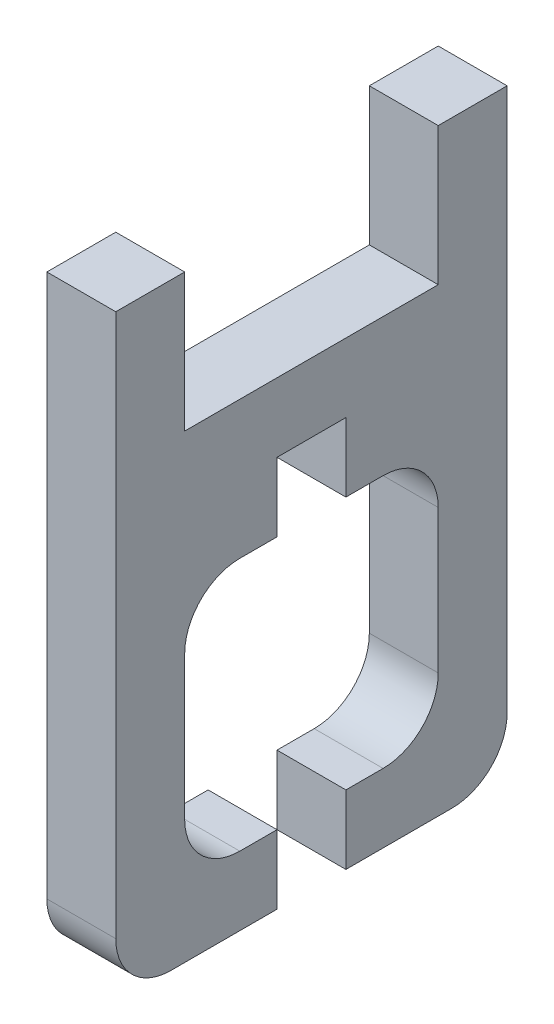
ISO-10303-21;
HEADER;
FILE_DESCRIPTION(('STEP AP214'),'2;1');
FILE_NAME('part.step','',(''),(''),'','','');
FILE_SCHEMA(('AUTOMOTIVE_DESIGN { 1 0 10303 214 1 1 1 1 }'));
ENDSEC;
DATA;
#1=APPLICATION_CONTEXT('core data for automotive mechanical design processes');
#2=APPLICATION_PROTOCOL_DEFINITION('international standard','automotive_design',2000,#1);
#3=PRODUCT_CONTEXT('',#1,'mechanical');
#4=PRODUCT('Part','Part','',(#3));
#5=PRODUCT_RELATED_PRODUCT_CATEGORY('part','',(#4));
#6=PRODUCT_DEFINITION_FORMATION('','',#4);
#7=PRODUCT_DEFINITION_CONTEXT('part definition',#1,'design');
#8=PRODUCT_DEFINITION('design','',#6,#7);
#9=PRODUCT_DEFINITION_SHAPE('','',#8);
#10=(LENGTH_UNIT() NAMED_UNIT(*) SI_UNIT(.MILLI.,.METRE.));
#11=(NAMED_UNIT(*) PLANE_ANGLE_UNIT() SI_UNIT($,.RADIAN.));
#12=(NAMED_UNIT(*) SI_UNIT($,.STERADIAN.) SOLID_ANGLE_UNIT());
#13=UNCERTAINTY_MEASURE_WITH_UNIT(LENGTH_MEASURE(1.E-05),#10,'distance_accuracy_value','');
#14=(GEOMETRIC_REPRESENTATION_CONTEXT(3) GLOBAL_UNCERTAINTY_ASSIGNED_CONTEXT((#13)) GLOBAL_UNIT_ASSIGNED_CONTEXT((#10,
#11,#12)) REPRESENTATION_CONTEXT('',''));
#15=CARTESIAN_POINT('',(0.,0.,0.));
#16=DIRECTION('',(0.,0.,1.));
#17=DIRECTION('',(1.,0.,0.));
#18=AXIS2_PLACEMENT_3D('',#15,#16,#17);
#19=CARTESIAN_POINT('',(6.35,0.,0.));
#20=DIRECTION('',(0.,0.,-1.));
#21=DIRECTION('',(0.,1.,0.));
#22=AXIS2_PLACEMENT_3D('',#19,#20,#21);
#23=PLANE('',#22);
#24=DIRECTION('',(0.,-1.,0.));
#25=VECTOR('',#24,1.);
#26=CARTESIAN_POINT('',(0.,0.,0.));
#27=LINE('',#26,#25);
#28=CARTESIAN_POINT('',(0.,55.118,0.));
#29=VERTEX_POINT('',#28);
#30=CARTESIAN_POINT('',(0.,5.08000000000004,0.));
#31=VERTEX_POINT('',#30);
#32=EDGE_CURVE('E251',#29,#31,#27,.T.);
#33=ORIENTED_EDGE('',*,*,#32,.T.);
#34=DIRECTION('',(-1.,0.,0.));
#35=VECTOR('',#34,1.);
#36=CARTESIAN_POINT('',(6.35,5.08000000000004,0.));
#37=LINE('',#36,#35);
#38=CARTESIAN_POINT('',(6.35,5.08000000000004,0.));
#39=VERTEX_POINT('',#38);
#40=EDGE_CURVE('E11',#39,#31,#37,.T.);
#41=ORIENTED_EDGE('',*,*,#40,.F.);
#42=DIRECTION('',(0.,-1.,0.));
#43=VECTOR('',#42,1.);
#44=CARTESIAN_POINT('',(6.35,0.,0.));
#45=LINE('',#44,#43);
#46=CARTESIAN_POINT('',(6.35,55.118,0.));
#47=VERTEX_POINT('',#46);
#48=EDGE_CURVE('E341',#47,#39,#45,.T.);
#49=ORIENTED_EDGE('',*,*,#48,.F.);
#50=DIRECTION('',(-1.,0.,0.));
#51=VECTOR('',#50,1.);
#52=CARTESIAN_POINT('',(6.35,55.118,0.));
#53=LINE('',#52,#51);
#54=EDGE_CURVE('E58',#47,#29,#53,.T.);
#55=ORIENTED_EDGE('',*,*,#54,.T.);
#56=EDGE_LOOP('',(#33,#41,#49,#55));
#57=FACE_BOUND('',#56,.T.);
#58=ADVANCED_FACE('F41',(#57),#23,.F.);
#59=CARTESIAN_POINT('',(6.35,5.08,-5.08));
#60=DIRECTION('',(-1.,0.,0.));
#61=DIRECTION('',(0.,0.,1.));
#62=AXIS2_PLACEMENT_3D('',#59,#60,#61);
#63=CYLINDRICAL_SURFACE('',#62,5.08);
#64=CARTESIAN_POINT('',(0.,5.08,-5.08));
#65=DIRECTION('',(1.,0.,0.));
#66=DIRECTION('',(0.,0.,-1.));
#67=AXIS2_PLACEMENT_3D('',#64,#65,#66);
#68=CIRCLE('',#67,5.08);
#69=CARTESIAN_POINT('',(0.,0.,-5.08000000000004));
#70=VERTEX_POINT('',#69);
#71=EDGE_CURVE('E254',#31,#70,#68,.T.);
#72=ORIENTED_EDGE('',*,*,#71,.T.);
#73=DIRECTION('',(-1.,0.,0.));
#74=VECTOR('',#73,1.);
#75=CARTESIAN_POINT('',(6.35,0.,-5.08000000000004));
#76=LINE('',#75,#74);
#77=CARTESIAN_POINT('',(6.35,0.,-5.08000000000004));
#78=VERTEX_POINT('',#77);
#79=EDGE_CURVE('E50',#78,#70,#76,.T.);
#80=ORIENTED_EDGE('',*,*,#79,.F.);
#81=CARTESIAN_POINT('',(6.35,5.08,-5.08));
#82=DIRECTION('',(1.,0.,0.));
#83=DIRECTION('',(0.,0.,-1.));
#84=AXIS2_PLACEMENT_3D('',#81,#82,#83);
#85=CIRCLE('',#84,5.08);
#86=EDGE_CURVE('E150',#39,#78,#85,.T.);
#87=ORIENTED_EDGE('',*,*,#86,.F.);
#88=ORIENTED_EDGE('',*,*,#40,.T.);
#89=EDGE_LOOP('',(#72,#80,#87,#88));
#90=FACE_BOUND('',#89,.T.);
#91=ADVANCED_FACE('F417',(#90),#63,.T.);
#92=CARTESIAN_POINT('',(6.35,0.,0.));
#93=DIRECTION('',(0.,-1.,0.));
#94=DIRECTION('',(0.,0.,-1.));
#95=AXIS2_PLACEMENT_3D('',#92,#93,#94);
#96=PLANE('',#95);
#97=DIRECTION('',(0.,0.,1.));
#98=VECTOR('',#97,1.);
#99=CARTESIAN_POINT('',(0.,0.,0.));
#100=LINE('',#99,#98);
#101=CARTESIAN_POINT('',(0.,0.,-14.859));
#102=VERTEX_POINT('',#101);
#103=EDGE_CURVE('E258',#102,#70,#100,.T.);
#104=ORIENTED_EDGE('',*,*,#103,.F.);
#105=DIRECTION('',(-1.,0.,0.));
#106=VECTOR('',#105,1.);
#107=CARTESIAN_POINT('',(6.35,0.,-14.859));
#108=LINE('',#107,#106);
#109=CARTESIAN_POINT('',(6.35,0.,-14.859));
#110=VERTEX_POINT('',#109);
#111=EDGE_CURVE('E408',#110,#102,#108,.T.);
#112=ORIENTED_EDGE('',*,*,#111,.F.);
#113=DIRECTION('',(0.,0.,1.));
#114=VECTOR('',#113,1.);
#115=CARTESIAN_POINT('',(6.35,0.,0.));
#116=LINE('',#115,#114);
#117=EDGE_CURVE('E416',#110,#78,#116,.T.);
#118=ORIENTED_EDGE('',*,*,#117,.T.);
#119=ORIENTED_EDGE('',*,*,#79,.T.);
#120=EDGE_LOOP('',(#104,#112,#118,#119));
#121=FACE_BOUND('',#120,.T.);
#122=ADVANCED_FACE('F414',(#121),#96,.T.);
#123=CARTESIAN_POINT('',(6.35,0.,-14.859));
#124=DIRECTION('',(0.,0.,-1.));
#125=DIRECTION('',(0.,1.,0.));
#126=AXIS2_PLACEMENT_3D('',#123,#124,#125);
#127=PLANE('',#126);
#128=DIRECTION('',(0.,-1.,0.));
#129=VECTOR('',#128,1.);
#130=CARTESIAN_POINT('',(0.,0.,-14.859));
#131=LINE('',#130,#129);
#132=CARTESIAN_POINT('',(0.,6.35,-14.859));
#133=VERTEX_POINT('',#132);
#134=EDGE_CURVE('E262',#133,#102,#131,.T.);
#135=ORIENTED_EDGE('',*,*,#134,.F.);
#136=DIRECTION('',(-1.,0.,0.));
#137=VECTOR('',#136,1.);
#138=CARTESIAN_POINT('',(6.35,6.35,-14.859));
#139=LINE('',#138,#137);
#140=CARTESIAN_POINT('',(6.35,6.35,-14.859));
#141=VERTEX_POINT('',#140);
#142=EDGE_CURVE('E405',#141,#133,#139,.T.);
#143=ORIENTED_EDGE('',*,*,#142,.F.);
#144=DIRECTION('',(0.,-1.,0.));
#145=VECTOR('',#144,1.);
#146=CARTESIAN_POINT('',(6.35,0.,-14.859));
#147=LINE('',#146,#145);
#148=EDGE_CURVE('E428',#141,#110,#147,.T.);
#149=ORIENTED_EDGE('',*,*,#148,.T.);
#150=ORIENTED_EDGE('',*,*,#111,.T.);
#151=EDGE_LOOP('',(#135,#143,#149,#150));
#152=FACE_BOUND('',#151,.T.);
#153=ADVANCED_FACE('F425',(#152),#127,.T.);
#154=CARTESIAN_POINT('',(6.35,6.35,0.));
#155=DIRECTION('',(0.,1.,0.));
#156=DIRECTION('',(0.,0.,1.));
#157=AXIS2_PLACEMENT_3D('',#154,#155,#156);
#158=PLANE('',#157);
#159=DIRECTION('',(0.,0.,-1.));
#160=VECTOR('',#159,1.);
#161=CARTESIAN_POINT('',(0.,6.35,0.));
#162=LINE('',#161,#160);
#163=CARTESIAN_POINT('',(0.,6.35,-11.43));
#164=VERTEX_POINT('',#163);
#165=EDGE_CURVE('E267',#164,#133,#162,.T.);
#166=ORIENTED_EDGE('',*,*,#165,.F.);
#167=DIRECTION('',(-1.,0.,0.));
#168=VECTOR('',#167,1.);
#169=CARTESIAN_POINT('',(6.35,6.35,-11.43));
#170=LINE('',#169,#168);
#171=CARTESIAN_POINT('',(6.35,6.35,-11.43));
#172=VERTEX_POINT('',#171);
#173=EDGE_CURVE('E402',#172,#164,#170,.T.);
#174=ORIENTED_EDGE('',*,*,#173,.F.);
#175=DIRECTION('',(0.,0.,-1.));
#176=VECTOR('',#175,1.);
#177=CARTESIAN_POINT('',(6.35,6.35,0.));
#178=LINE('',#177,#176);
#179=EDGE_CURVE('E436',#172,#141,#178,.T.);
#180=ORIENTED_EDGE('',*,*,#179,.T.);
#181=ORIENTED_EDGE('',*,*,#142,.T.);
#182=EDGE_LOOP('',(#166,#174,#180,#181));
#183=FACE_BOUND('',#182,.T.);
#184=ADVANCED_FACE('F562',(#183),#158,.T.);
#185=CARTESIAN_POINT('',(6.35,11.43,-11.43));
#186=DIRECTION('',(-1.,0.,0.));
#187=DIRECTION('',(0.,0.,1.));
#188=AXIS2_PLACEMENT_3D('',#185,#186,#187);
#189=CYLINDRICAL_SURFACE('',#188,5.08);
#190=CARTESIAN_POINT('',(0.,11.43,-11.43));
#191=DIRECTION('',(1.,0.,0.));
#192=DIRECTION('',(0.,0.,-1.));
#193=AXIS2_PLACEMENT_3D('',#190,#191,#192);
#194=CIRCLE('',#193,5.08);
#195=CARTESIAN_POINT('',(0.,11.43,-6.35));
#196=VERTEX_POINT('',#195);
#197=EDGE_CURVE('E271',#164,#196,#194,.F.);
#198=ORIENTED_EDGE('',*,*,#197,.T.);
#199=DIRECTION('',(-1.,0.,0.));
#200=VECTOR('',#199,1.);
#201=CARTESIAN_POINT('',(6.35,11.43,-6.35));
#202=LINE('',#201,#200);
#203=CARTESIAN_POINT('',(6.35,11.43,-6.35));
#204=VERTEX_POINT('',#203);
#205=EDGE_CURVE('E398',#204,#196,#202,.T.);
#206=ORIENTED_EDGE('',*,*,#205,.F.);
#207=CARTESIAN_POINT('',(6.35,11.43,-11.43));
#208=DIRECTION('',(1.,0.,0.));
#209=DIRECTION('',(0.,0.,-1.));
#210=AXIS2_PLACEMENT_3D('',#207,#208,#209);
#211=CIRCLE('',#210,5.08);
#212=EDGE_CURVE('E560',#172,#204,#211,.F.);
#213=ORIENTED_EDGE('',*,*,#212,.F.);
#214=ORIENTED_EDGE('',*,*,#173,.T.);
#215=EDGE_LOOP('',(#198,#206,#213,#214));
#216=FACE_BOUND('',#215,.T.);
#217=ADVANCED_FACE('F559',(#216),#189,.F.);
#218=CARTESIAN_POINT('',(6.35,0.,-6.35));
#219=DIRECTION('',(0.,0.,1.));
#220=DIRECTION('',(1.,0.,0.));
#221=AXIS2_PLACEMENT_3D('',#218,#219,#220);
#222=PLANE('',#221);
#223=DIRECTION('',(0.,1.,0.));
#224=VECTOR('',#223,1.);
#225=CARTESIAN_POINT('',(0.,0.,-6.35));
#226=LINE('',#225,#224);
#227=CARTESIAN_POINT('',(0.,24.638,-6.35));
#228=VERTEX_POINT('',#227);
#229=EDGE_CURVE('E275',#196,#228,#226,.T.);
#230=ORIENTED_EDGE('',*,*,#229,.T.);
#231=DIRECTION('',(-1.,0.,0.));
#232=VECTOR('',#231,1.);
#233=CARTESIAN_POINT('',(6.35,24.638,-6.35));
#234=LINE('',#233,#232);
#235=CARTESIAN_POINT('',(6.35,24.638,-6.35));
#236=VERTEX_POINT('',#235);
#237=EDGE_CURVE('E394',#236,#228,#234,.T.);
#238=ORIENTED_EDGE('',*,*,#237,.F.);
#239=DIRECTION('',(0.,1.,0.));
#240=VECTOR('',#239,1.);
#241=CARTESIAN_POINT('',(6.35,0.,-6.35));
#242=LINE('',#241,#240);
#243=EDGE_CURVE('E555',#204,#236,#242,.T.);
#244=ORIENTED_EDGE('',*,*,#243,.F.);
#245=ORIENTED_EDGE('',*,*,#205,.T.);
#246=EDGE_LOOP('',(#230,#238,#244,#245));
#247=FACE_BOUND('',#246,.T.);
#248=ADVANCED_FACE('F554',(#247),#222,.F.);
#249=CARTESIAN_POINT('',(6.35,24.638,-11.43));
#250=DIRECTION('',(-1.,0.,0.));
#251=DIRECTION('',(0.,0.,1.));
#252=AXIS2_PLACEMENT_3D('',#249,#250,#251);
#253=CYLINDRICAL_SURFACE('',#252,5.08);
#254=CARTESIAN_POINT('',(0.,24.638,-11.43));
#255=DIRECTION('',(1.,0.,0.));
#256=DIRECTION('',(0.,0.,-1.));
#257=AXIS2_PLACEMENT_3D('',#254,#255,#256);
#258=CIRCLE('',#257,5.08);
#259=CARTESIAN_POINT('',(0.,29.718,-11.43));
#260=VERTEX_POINT('',#259);
#261=EDGE_CURVE('E278',#228,#260,#258,.F.);
#262=ORIENTED_EDGE('',*,*,#261,.T.);
#263=DIRECTION('',(-1.,0.,0.));
#264=VECTOR('',#263,1.);
#265=CARTESIAN_POINT('',(6.35,29.718,-11.43));
#266=LINE('',#265,#264);
#267=CARTESIAN_POINT('',(6.35,29.718,-11.43));
#268=VERTEX_POINT('',#267);
#269=EDGE_CURVE('E391',#268,#260,#266,.T.);
#270=ORIENTED_EDGE('',*,*,#269,.F.);
#271=CARTESIAN_POINT('',(6.35,24.638,-11.43));
#272=DIRECTION('',(1.,0.,0.));
#273=DIRECTION('',(0.,0.,-1.));
#274=AXIS2_PLACEMENT_3D('',#271,#272,#273);
#275=CIRCLE('',#274,5.08);
#276=EDGE_CURVE('E551',#236,#268,#275,.F.);
#277=ORIENTED_EDGE('',*,*,#276,.F.);
#278=ORIENTED_EDGE('',*,*,#237,.T.);
#279=EDGE_LOOP('',(#262,#270,#277,#278));
#280=FACE_BOUND('',#279,.T.);
#281=ADVANCED_FACE('F548',(#280),#253,.F.);
#282=CARTESIAN_POINT('',(6.35,29.718,0.));
#283=DIRECTION('',(0.,-1.,0.));
#284=DIRECTION('',(0.,0.,-1.));
#285=AXIS2_PLACEMENT_3D('',#282,#283,#284);
#286=PLANE('',#285);
#287=DIRECTION('',(0.,0.,1.));
#288=VECTOR('',#287,1.);
#289=CARTESIAN_POINT('',(0.,29.718,0.));
#290=LINE('',#289,#288);
#291=CARTESIAN_POINT('',(0.,29.718,-14.859));
#292=VERTEX_POINT('',#291);
#293=EDGE_CURVE('E282',#292,#260,#290,.T.);
#294=ORIENTED_EDGE('',*,*,#293,.F.);
#295=DIRECTION('',(-1.,0.,0.));
#296=VECTOR('',#295,1.);
#297=CARTESIAN_POINT('',(6.35,29.718,-14.859));
#298=LINE('',#297,#296);
#299=CARTESIAN_POINT('',(6.35,29.718,-14.859));
#300=VERTEX_POINT('',#299);
#301=EDGE_CURVE('E388',#300,#292,#298,.T.);
#302=ORIENTED_EDGE('',*,*,#301,.F.);
#303=DIRECTION('',(0.,0.,1.));
#304=VECTOR('',#303,1.);
#305=CARTESIAN_POINT('',(6.35,29.718,0.));
#306=LINE('',#305,#304);
#307=EDGE_CURVE('E571',#300,#268,#306,.T.);
#308=ORIENTED_EDGE('',*,*,#307,.T.);
#309=ORIENTED_EDGE('',*,*,#269,.T.);
#310=EDGE_LOOP('',(#294,#302,#308,#309));
#311=FACE_BOUND('',#310,.T.);
#312=ADVANCED_FACE('F543',(#311),#286,.T.);
#313=CARTESIAN_POINT('',(6.35,0.,-14.859));
#314=DIRECTION('',(0.,0.,-1.));
#315=DIRECTION('',(-1.,0.,0.));
#316=AXIS2_PLACEMENT_3D('',#313,#314,#315);
#317=PLANE('',#316);
#318=DIRECTION('',(0.,-1.,0.));
#319=VECTOR('',#318,1.);
#320=CARTESIAN_POINT('',(0.,0.,-14.859));
#321=LINE('',#320,#319);
#322=CARTESIAN_POINT('',(0.,36.068,-14.859));
#323=VERTEX_POINT('',#322);
#324=EDGE_CURVE('E286',#323,#292,#321,.T.);
#325=ORIENTED_EDGE('',*,*,#324,.F.);
#326=DIRECTION('',(-1.,0.,0.));
#327=VECTOR('',#326,1.);
#328=CARTESIAN_POINT('',(6.35,36.068,-14.859));
#329=LINE('',#328,#327);
#330=CARTESIAN_POINT('',(6.35,36.068,-14.859));
#331=VERTEX_POINT('',#330);
#332=EDGE_CURVE('E385',#331,#323,#329,.T.);
#333=ORIENTED_EDGE('',*,*,#332,.F.);
#334=DIRECTION('',(0.,-1.,0.));
#335=VECTOR('',#334,1.);
#336=CARTESIAN_POINT('',(6.35,0.,-14.859));
#337=LINE('',#336,#335);
#338=EDGE_CURVE('E539',#331,#300,#337,.T.);
#339=ORIENTED_EDGE('',*,*,#338,.T.);
#340=ORIENTED_EDGE('',*,*,#301,.T.);
#341=EDGE_LOOP('',(#325,#333,#339,#340));
#342=FACE_BOUND('',#341,.T.);
#343=ADVANCED_FACE('F537',(#342),#317,.T.);
#344=CARTESIAN_POINT('',(6.35,36.068,0.));
#345=DIRECTION('',(0.,-1.,0.));
#346=DIRECTION('',(0.,0.,-1.));
#347=AXIS2_PLACEMENT_3D('',#344,#345,#346);
#348=PLANE('',#347);
#349=DIRECTION('',(0.,0.,1.));
#350=VECTOR('',#349,1.);
#351=CARTESIAN_POINT('',(0.,36.068,0.));
#352=LINE('',#351,#350);
#353=CARTESIAN_POINT('',(0.,36.068,-21.209));
#354=VERTEX_POINT('',#353);
#355=EDGE_CURVE('E290',#354,#323,#352,.T.);
#356=ORIENTED_EDGE('',*,*,#355,.F.);
#357=DIRECTION('',(-1.,0.,0.));
#358=VECTOR('',#357,1.);
#359=CARTESIAN_POINT('',(6.35,36.068,-21.209));
#360=LINE('',#359,#358);
#361=CARTESIAN_POINT('',(6.35,36.068,-21.209));
#362=VERTEX_POINT('',#361);
#363=EDGE_CURVE('E382',#362,#354,#360,.T.);
#364=ORIENTED_EDGE('',*,*,#363,.F.);
#365=DIRECTION('',(0.,0.,1.));
#366=VECTOR('',#365,1.);
#367=CARTESIAN_POINT('',(6.35,36.068,0.));
#368=LINE('',#367,#366);
#369=EDGE_CURVE('E533',#362,#331,#368,.T.);
#370=ORIENTED_EDGE('',*,*,#369,.T.);
#371=ORIENTED_EDGE('',*,*,#332,.T.);
#372=EDGE_LOOP('',(#356,#364,#370,#371));
#373=FACE_BOUND('',#372,.T.);
#374=ADVANCED_FACE('F530',(#373),#348,.T.);
#375=CARTESIAN_POINT('',(6.35,0.,-21.209));
#376=DIRECTION('',(0.,0.,1.));
#377=DIRECTION('',(1.,0.,0.));
#378=AXIS2_PLACEMENT_3D('',#375,#376,#377);
#379=PLANE('',#378);
#380=DIRECTION('',(0.,1.,0.));
#381=VECTOR('',#380,1.);
#382=CARTESIAN_POINT('',(0.,0.,-21.209));
#383=LINE('',#382,#381);
#384=CARTESIAN_POINT('',(0.,29.718,-21.209));
#385=VERTEX_POINT('',#384);
#386=EDGE_CURVE('E294',#385,#354,#383,.T.);
#387=ORIENTED_EDGE('',*,*,#386,.F.);
#388=DIRECTION('',(-1.,0.,0.));
#389=VECTOR('',#388,1.);
#390=CARTESIAN_POINT('',(6.35,29.718,-21.209));
#391=LINE('',#390,#389);
#392=CARTESIAN_POINT('',(6.35,29.718,-21.209));
#393=VERTEX_POINT('',#392);
#394=EDGE_CURVE('E379',#393,#385,#391,.T.);
#395=ORIENTED_EDGE('',*,*,#394,.F.);
#396=DIRECTION('',(0.,1.,0.));
#397=VECTOR('',#396,1.);
#398=CARTESIAN_POINT('',(6.35,0.,-21.209));
#399=LINE('',#398,#397);
#400=EDGE_CURVE('E578',#393,#362,#399,.T.);
#401=ORIENTED_EDGE('',*,*,#400,.T.);
#402=ORIENTED_EDGE('',*,*,#363,.T.);
#403=EDGE_LOOP('',(#387,#395,#401,#402));
#404=FACE_BOUND('',#403,.T.);
#405=ADVANCED_FACE('F526',(#404),#379,.T.);
#406=CARTESIAN_POINT('',(6.35,29.718,0.));
#407=DIRECTION('',(0.,-1.,0.));
#408=DIRECTION('',(0.,0.,-1.));
#409=AXIS2_PLACEMENT_3D('',#406,#407,#408);
#410=PLANE('',#409);
#411=DIRECTION('',(0.,0.,1.));
#412=VECTOR('',#411,1.);
#413=CARTESIAN_POINT('',(0.,29.718,0.));
#414=LINE('',#413,#412);
#415=CARTESIAN_POINT('',(0.,29.718,-24.638));
#416=VERTEX_POINT('',#415);
#417=EDGE_CURVE('E298',#416,#385,#414,.T.);
#418=ORIENTED_EDGE('',*,*,#417,.F.);
#419=DIRECTION('',(-1.,0.,0.));
#420=VECTOR('',#419,1.);
#421=CARTESIAN_POINT('',(6.35,29.718,-24.638));
#422=LINE('',#421,#420);
#423=CARTESIAN_POINT('',(6.35,29.718,-24.638));
#424=VERTEX_POINT('',#423);
#425=EDGE_CURVE('E376',#424,#416,#422,.T.);
#426=ORIENTED_EDGE('',*,*,#425,.F.);
#427=DIRECTION('',(0.,0.,1.));
#428=VECTOR('',#427,1.);
#429=CARTESIAN_POINT('',(6.35,29.718,0.));
#430=LINE('',#429,#428);
#431=EDGE_CURVE('E522',#424,#393,#430,.T.);
#432=ORIENTED_EDGE('',*,*,#431,.T.);
#433=ORIENTED_EDGE('',*,*,#394,.T.);
#434=EDGE_LOOP('',(#418,#426,#432,#433));
#435=FACE_BOUND('',#434,.T.);
#436=ADVANCED_FACE('F517',(#435),#410,.T.);
#437=CARTESIAN_POINT('',(6.35,24.638,-24.638));
#438=DIRECTION('',(-1.,0.,0.));
#439=DIRECTION('',(0.,0.,1.));
#440=AXIS2_PLACEMENT_3D('',#437,#438,#439);
#441=CYLINDRICAL_SURFACE('',#440,5.08);
#442=CARTESIAN_POINT('',(0.,24.638,-24.638));
#443=DIRECTION('',(1.,0.,0.));
#444=DIRECTION('',(0.,0.,-1.));
#445=AXIS2_PLACEMENT_3D('',#442,#443,#444);
#446=CIRCLE('',#445,5.08);
#447=CARTESIAN_POINT('',(0.,24.638,-29.718));
#448=VERTEX_POINT('',#447);
#449=EDGE_CURVE('E302',#416,#448,#446,.F.);
#450=ORIENTED_EDGE('',*,*,#449,.T.);
#451=DIRECTION('',(-1.,0.,0.));
#452=VECTOR('',#451,1.);
#453=CARTESIAN_POINT('',(6.35,24.638,-29.718));
#454=LINE('',#453,#452);
#455=CARTESIAN_POINT('',(6.35,24.638,-29.718));
#456=VERTEX_POINT('',#455);
#457=EDGE_CURVE('E373',#456,#448,#454,.T.);
#458=ORIENTED_EDGE('',*,*,#457,.F.);
#459=CARTESIAN_POINT('',(6.35,24.638,-24.638));
#460=DIRECTION('',(1.,0.,0.));
#461=DIRECTION('',(0.,0.,-1.));
#462=AXIS2_PLACEMENT_3D('',#459,#460,#461);
#463=CIRCLE('',#462,5.08);
#464=EDGE_CURVE('E583',#424,#456,#463,.F.);
#465=ORIENTED_EDGE('',*,*,#464,.F.);
#466=ORIENTED_EDGE('',*,*,#425,.T.);
#467=EDGE_LOOP('',(#450,#458,#465,#466));
#468=FACE_BOUND('',#467,.T.);
#469=ADVANCED_FACE('F588',(#468),#441,.F.);
#470=CARTESIAN_POINT('',(6.35,0.,-29.718));
#471=DIRECTION('',(0.,0.,1.));
#472=DIRECTION('',(1.,0.,0.));
#473=AXIS2_PLACEMENT_3D('',#470,#471,#472);
#474=PLANE('',#473);
#475=DIRECTION('',(0.,1.,0.));
#476=VECTOR('',#475,1.);
#477=CARTESIAN_POINT('',(0.,0.,-29.718));
#478=LINE('',#477,#476);
#479=CARTESIAN_POINT('',(0.,11.43,-29.718));
#480=VERTEX_POINT('',#479);
#481=EDGE_CURVE('E306',#480,#448,#478,.T.);
#482=ORIENTED_EDGE('',*,*,#481,.F.);
#483=DIRECTION('',(-1.,0.,0.));
#484=VECTOR('',#483,1.);
#485=CARTESIAN_POINT('',(6.35,11.43,-29.718));
#486=LINE('',#485,#484);
#487=CARTESIAN_POINT('',(6.35,11.43,-29.718));
#488=VERTEX_POINT('',#487);
#489=EDGE_CURVE('E370',#488,#480,#486,.T.);
#490=ORIENTED_EDGE('',*,*,#489,.F.);
#491=DIRECTION('',(0.,1.,0.));
#492=VECTOR('',#491,1.);
#493=CARTESIAN_POINT('',(6.35,0.,-29.718));
#494=LINE('',#493,#492);
#495=EDGE_CURVE('E585',#488,#456,#494,.T.);
#496=ORIENTED_EDGE('',*,*,#495,.T.);
#497=ORIENTED_EDGE('',*,*,#457,.T.);
#498=EDGE_LOOP('',(#482,#490,#496,#497));
#499=FACE_BOUND('',#498,.T.);
#500=ADVANCED_FACE('F511',(#499),#474,.T.);
#501=CARTESIAN_POINT('',(6.35,11.43,-24.638));
#502=DIRECTION('',(-1.,0.,0.));
#503=DIRECTION('',(0.,0.,1.));
#504=AXIS2_PLACEMENT_3D('',#501,#502,#503);
#505=CYLINDRICAL_SURFACE('',#504,5.08);
#506=CARTESIAN_POINT('',(0.,11.43,-24.638));
#507=DIRECTION('',(1.,0.,0.));
#508=DIRECTION('',(0.,0.,-1.));
#509=AXIS2_PLACEMENT_3D('',#506,#507,#508);
#510=CIRCLE('',#509,5.08);
#511=CARTESIAN_POINT('',(0.,6.35,-24.638));
#512=VERTEX_POINT('',#511);
#513=EDGE_CURVE('E310',#512,#480,#510,.T.);
#514=ORIENTED_EDGE('',*,*,#513,.F.);
#515=DIRECTION('',(-1.,0.,0.));
#516=VECTOR('',#515,1.);
#517=CARTESIAN_POINT('',(6.35,6.35,-24.638));
#518=LINE('',#517,#516);
#519=CARTESIAN_POINT('',(6.35,6.35,-24.638));
#520=VERTEX_POINT('',#519);
#521=EDGE_CURVE('E367',#520,#512,#518,.T.);
#522=ORIENTED_EDGE('',*,*,#521,.F.);
#523=CARTESIAN_POINT('',(6.35,11.43,-24.638));
#524=DIRECTION('',(1.,0.,0.));
#525=DIRECTION('',(0.,0.,-1.));
#526=AXIS2_PLACEMENT_3D('',#523,#524,#525);
#527=CIRCLE('',#526,5.08);
#528=EDGE_CURVE('E457',#520,#488,#527,.T.);
#529=ORIENTED_EDGE('',*,*,#528,.T.);
#530=ORIENTED_EDGE('',*,*,#489,.T.);
#531=EDGE_LOOP('',(#514,#522,#529,#530));
#532=FACE_BOUND('',#531,.T.);
#533=ADVANCED_FACE('F506',(#532),#505,.F.);
#534=CARTESIAN_POINT('',(0.,6.35,-21.209));
#535=VERTEX_POINT('',#534);
#536=EDGE_CURVE('E272',#535,#512,#162,.T.);
#537=ORIENTED_EDGE('',*,*,#536,.F.);
#538=DIRECTION('',(-1.,0.,0.));
#539=VECTOR('',#538,1.);
#540=CARTESIAN_POINT('',(6.35,6.35,-21.209));
#541=LINE('',#540,#539);
#542=CARTESIAN_POINT('',(6.35,6.35,-21.209));
#543=VERTEX_POINT('',#542);
#544=EDGE_CURVE('E364',#543,#535,#541,.T.);
#545=ORIENTED_EDGE('',*,*,#544,.F.);
#546=EDGE_CURVE('E450',#543,#520,#178,.T.);
#547=ORIENTED_EDGE('',*,*,#546,.T.);
#548=ORIENTED_EDGE('',*,*,#521,.T.);
#549=EDGE_LOOP('',(#537,#545,#547,#548));
#550=FACE_BOUND('',#549,.T.);
#551=ADVANCED_FACE('F502',(#550),#158,.T.);
#552=CARTESIAN_POINT('',(6.35,0.,-21.209));
#553=DIRECTION('',(0.,0.,-1.));
#554=DIRECTION('',(-1.,0.,0.));
#555=AXIS2_PLACEMENT_3D('',#552,#553,#554);
#556=PLANE('',#555);
#557=DIRECTION('',(0.,-1.,0.));
#558=VECTOR('',#557,1.);
#559=CARTESIAN_POINT('',(0.,0.,-21.209));
#560=LINE('',#559,#558);
#561=CARTESIAN_POINT('',(0.,0.,-21.209));
#562=VERTEX_POINT('',#561);
#563=EDGE_CURVE('E314',#535,#562,#560,.T.);
#564=ORIENTED_EDGE('',*,*,#563,.T.);
#565=DIRECTION('',(-1.,0.,0.));
#566=VECTOR('',#565,1.);
#567=CARTESIAN_POINT('',(6.35,0.,-21.209));
#568=LINE('',#567,#566);
#569=CARTESIAN_POINT('',(6.35,0.,-21.209));
#570=VERTEX_POINT('',#569);
#571=EDGE_CURVE('E361',#570,#562,#568,.T.);
#572=ORIENTED_EDGE('',*,*,#571,.F.);
#573=DIRECTION('',(0.,-1.,0.));
#574=VECTOR('',#573,1.);
#575=CARTESIAN_POINT('',(6.35,0.,-21.209));
#576=LINE('',#575,#574);
#577=EDGE_CURVE('E442',#543,#570,#576,.T.);
#578=ORIENTED_EDGE('',*,*,#577,.F.);
#579=ORIENTED_EDGE('',*,*,#544,.T.);
#580=EDGE_LOOP('',(#564,#572,#578,#579));
#581=FACE_BOUND('',#580,.T.);
#582=ADVANCED_FACE('F627',(#581),#556,.F.);
#583=CARTESIAN_POINT('',(0.,0.,-30.988));
#584=VERTEX_POINT('',#583);
#585=EDGE_CURVE('E263',#584,#562,#100,.T.);
#586=ORIENTED_EDGE('',*,*,#585,.F.);
#587=DIRECTION('',(-1.,0.,0.));
#588=VECTOR('',#587,1.);
#589=CARTESIAN_POINT('',(6.35,0.,-30.988));
#590=LINE('',#589,#588);
#591=CARTESIAN_POINT('',(6.35,0.,-30.988));
#592=VERTEX_POINT('',#591);
#593=EDGE_CURVE('E358',#592,#584,#590,.T.);
#594=ORIENTED_EDGE('',*,*,#593,.F.);
#595=EDGE_CURVE('E433',#592,#570,#116,.T.);
#596=ORIENTED_EDGE('',*,*,#595,.T.);
#597=ORIENTED_EDGE('',*,*,#571,.T.);
#598=EDGE_LOOP('',(#586,#594,#596,#597));
#599=FACE_BOUND('',#598,.T.);
#600=ADVANCED_FACE('F620',(#599),#96,.T.);
#601=CARTESIAN_POINT('',(6.35,5.08,-30.988));
#602=DIRECTION('',(-1.,0.,0.));
#603=DIRECTION('',(0.,0.,1.));
#604=AXIS2_PLACEMENT_3D('',#601,#602,#603);
#605=CYLINDRICAL_SURFACE('',#604,5.08);
#606=CARTESIAN_POINT('',(0.,5.08,-30.988));
#607=DIRECTION('',(1.,0.,0.));
#608=DIRECTION('',(0.,0.,-1.));
#609=AXIS2_PLACEMENT_3D('',#606,#607,#608);
#610=CIRCLE('',#609,5.08);
#611=CARTESIAN_POINT('',(0.,5.08000000000004,-36.068));
#612=VERTEX_POINT('',#611);
#613=EDGE_CURVE('E318',#612,#584,#610,.F.);
#614=ORIENTED_EDGE('',*,*,#613,.F.);
#615=DIRECTION('',(-1.,0.,0.));
#616=VECTOR('',#615,1.);
#617=CARTESIAN_POINT('',(6.35,5.08000000000004,-36.068));
#618=LINE('',#617,#616);
#619=CARTESIAN_POINT('',(6.35,5.08000000000004,-36.068));
#620=VERTEX_POINT('',#619);
#621=EDGE_CURVE('E355',#620,#612,#618,.T.);
#622=ORIENTED_EDGE('',*,*,#621,.F.);
#623=CARTESIAN_POINT('',(6.35,5.08,-30.988));
#624=DIRECTION('',(1.,0.,0.));
#625=DIRECTION('',(0.,0.,-1.));
#626=AXIS2_PLACEMENT_3D('',#623,#624,#625);
#627=CIRCLE('',#626,5.08);
#628=EDGE_CURVE('E441',#620,#592,#627,.F.);
#629=ORIENTED_EDGE('',*,*,#628,.T.);
#630=ORIENTED_EDGE('',*,*,#593,.T.);
#631=EDGE_LOOP('',(#614,#622,#629,#630));
#632=FACE_BOUND('',#631,.T.);
#633=ADVANCED_FACE('F626',(#632),#605,.T.);
#634=CARTESIAN_POINT('',(6.35,0.,-36.068));
#635=DIRECTION('',(0.,0.,-1.));
#636=DIRECTION('',(-1.,0.,0.));
#637=AXIS2_PLACEMENT_3D('',#634,#635,#636);
#638=PLANE('',#637);
#639=DIRECTION('',(0.,-1.,0.));
#640=VECTOR('',#639,1.);
#641=CARTESIAN_POINT('',(0.,0.,-36.068));
#642=LINE('',#641,#640);
#643=CARTESIAN_POINT('',(0.,55.118,-36.068));
#644=VERTEX_POINT('',#643);
#645=EDGE_CURVE('E322',#644,#612,#642,.T.);
#646=ORIENTED_EDGE('',*,*,#645,.F.);
#647=DIRECTION('',(-1.,0.,0.));
#648=VECTOR('',#647,1.);
#649=CARTESIAN_POINT('',(6.35,55.118,-36.068));
#650=LINE('',#649,#648);
#651=CARTESIAN_POINT('',(6.35,55.118,-36.068));
#652=VERTEX_POINT('',#651);
#653=EDGE_CURVE('E352',#652,#644,#650,.T.);
#654=ORIENTED_EDGE('',*,*,#653,.F.);
#655=DIRECTION('',(0.,-1.,0.));
#656=VECTOR('',#655,1.);
#657=CARTESIAN_POINT('',(6.35,0.,-36.068));
#658=LINE('',#657,#656);
#659=EDGE_CURVE('E448',#652,#620,#658,.T.);
#660=ORIENTED_EDGE('',*,*,#659,.T.);
#661=ORIENTED_EDGE('',*,*,#621,.T.);
#662=EDGE_LOOP('',(#646,#654,#660,#661));
#663=FACE_BOUND('',#662,.T.);
#664=ADVANCED_FACE('F632',(#663),#638,.T.);
#665=CARTESIAN_POINT('',(6.35,55.118,0.));
#666=DIRECTION('',(0.,-1.,0.));
#667=DIRECTION('',(0.,0.,-1.));
#668=AXIS2_PLACEMENT_3D('',#665,#666,#667);
#669=PLANE('',#668);
#670=DIRECTION('',(0.,0.,1.));
#671=VECTOR('',#670,1.);
#672=CARTESIAN_POINT('',(0.,55.118,0.));
#673=LINE('',#672,#671);
#674=CARTESIAN_POINT('',(0.,55.118,-29.718));
#675=VERTEX_POINT('',#674);
#676=EDGE_CURVE('E326',#644,#675,#673,.T.);
#677=ORIENTED_EDGE('',*,*,#676,.T.);
#678=DIRECTION('',(-1.,0.,0.));
#679=VECTOR('',#678,1.);
#680=CARTESIAN_POINT('',(6.35,55.118,-29.718));
#681=LINE('',#680,#679);
#682=CARTESIAN_POINT('',(6.35,55.118,-29.718));
#683=VERTEX_POINT('',#682);
#684=EDGE_CURVE('E348',#683,#675,#681,.T.);
#685=ORIENTED_EDGE('',*,*,#684,.F.);
#686=DIRECTION('',(0.,0.,1.));
#687=VECTOR('',#686,1.);
#688=CARTESIAN_POINT('',(6.35,55.118,0.));
#689=LINE('',#688,#687);
#690=EDGE_CURVE('E465',#652,#683,#689,.T.);
#691=ORIENTED_EDGE('',*,*,#690,.F.);
#692=ORIENTED_EDGE('',*,*,#653,.T.);
#693=EDGE_LOOP('',(#677,#685,#691,#692));
#694=FACE_BOUND('',#693,.T.);
#695=ADVANCED_FACE('F473',(#694),#669,.F.);
#696=CARTESIAN_POINT('',(6.35,0.,-29.718));
#697=DIRECTION('',(0.,0.,-1.));
#698=DIRECTION('',(-1.,0.,0.));
#699=AXIS2_PLACEMENT_3D('',#696,#697,#698);
#700=PLANE('',#699);
#701=DIRECTION('',(0.,-1.,0.));
#702=VECTOR('',#701,1.);
#703=CARTESIAN_POINT('',(0.,0.,-29.718));
#704=LINE('',#703,#702);
#705=CARTESIAN_POINT('',(0.,42.418,-29.718));
#706=VERTEX_POINT('',#705);
#707=EDGE_CURVE('E329',#675,#706,#704,.T.);
#708=ORIENTED_EDGE('',*,*,#707,.T.);
#709=DIRECTION('',(-1.,0.,0.));
#710=VECTOR('',#709,1.);
#711=CARTESIAN_POINT('',(6.35,42.418,-29.718));
#712=LINE('',#711,#710);
#713=CARTESIAN_POINT('',(6.35,42.418,-29.718));
#714=VERTEX_POINT('',#713);
#715=EDGE_CURVE('E241',#714,#706,#712,.T.);
#716=ORIENTED_EDGE('',*,*,#715,.F.);
#717=DIRECTION('',(0.,-1.,0.));
#718=VECTOR('',#717,1.);
#719=CARTESIAN_POINT('',(6.35,0.,-29.718));
#720=LINE('',#719,#718);
#721=EDGE_CURVE('E227',#683,#714,#720,.T.);
#722=ORIENTED_EDGE('',*,*,#721,.F.);
#723=ORIENTED_EDGE('',*,*,#684,.T.);
#724=EDGE_LOOP('',(#708,#716,#722,#723));
#725=FACE_BOUND('',#724,.T.);
#726=ADVANCED_FACE('F477',(#725),#700,.F.);
#727=CARTESIAN_POINT('',(6.35,42.418,0.));
#728=DIRECTION('',(0.,-1.,0.));
#729=DIRECTION('',(0.,0.,-1.));
#730=AXIS2_PLACEMENT_3D('',#727,#728,#729);
#731=PLANE('',#730);
#732=DIRECTION('',(0.,0.,1.));
#733=VECTOR('',#732,1.);
#734=CARTESIAN_POINT('',(0.,42.418,0.));
#735=LINE('',#734,#733);
#736=CARTESIAN_POINT('',(0.,42.418,-6.35));
#737=VERTEX_POINT('',#736);
#738=EDGE_CURVE('E237',#706,#737,#735,.T.);
#739=ORIENTED_EDGE('',*,*,#738,.T.);
#740=DIRECTION('',(-1.,0.,0.));
#741=VECTOR('',#740,1.);
#742=CARTESIAN_POINT('',(6.35,42.418,-6.35));
#743=LINE('',#742,#741);
#744=CARTESIAN_POINT('',(6.35,42.418,-6.35));
#745=VERTEX_POINT('',#744);
#746=EDGE_CURVE('E234',#745,#737,#743,.T.);
#747=ORIENTED_EDGE('',*,*,#746,.F.);
#748=DIRECTION('',(0.,0.,1.));
#749=VECTOR('',#748,1.);
#750=CARTESIAN_POINT('',(6.35,42.418,0.));
#751=LINE('',#750,#749);
#752=EDGE_CURVE('E220',#714,#745,#751,.T.);
#753=ORIENTED_EDGE('',*,*,#752,.F.);
#754=ORIENTED_EDGE('',*,*,#715,.T.);
#755=EDGE_LOOP('',(#739,#747,#753,#754));
#756=FACE_BOUND('',#755,.T.);
#757=ADVANCED_FACE('F235',(#756),#731,.F.);
#758=CARTESIAN_POINT('',(6.35,0.,-6.35));
#759=DIRECTION('',(0.,0.,-1.));
#760=DIRECTION('',(-1.,0.,0.));
#761=AXIS2_PLACEMENT_3D('',#758,#759,#760);
#762=PLANE('',#761);
#763=DIRECTION('',(0.,-1.,0.));
#764=VECTOR('',#763,1.);
#765=CARTESIAN_POINT('',(0.,0.,-6.35));
#766=LINE('',#765,#764);
#767=CARTESIAN_POINT('',(0.,55.118,-6.35));
#768=VERTEX_POINT('',#767);
#769=EDGE_CURVE('E334',#768,#737,#766,.T.);
#770=ORIENTED_EDGE('',*,*,#769,.F.);
#771=DIRECTION('',(-1.,0.,0.));
#772=VECTOR('',#771,1.);
#773=CARTESIAN_POINT('',(6.35,55.118,-6.35));
#774=LINE('',#773,#772);
#775=CARTESIAN_POINT('',(6.35,55.118,-6.35));
#776=VERTEX_POINT('',#775);
#777=EDGE_CURVE('E138',#776,#768,#774,.T.);
#778=ORIENTED_EDGE('',*,*,#777,.F.);
#779=DIRECTION('',(0.,-1.,0.));
#780=VECTOR('',#779,1.);
#781=CARTESIAN_POINT('',(6.35,0.,-6.35));
#782=LINE('',#781,#780);
#783=EDGE_CURVE('E225',#776,#745,#782,.T.);
#784=ORIENTED_EDGE('',*,*,#783,.T.);
#785=ORIENTED_EDGE('',*,*,#746,.T.);
#786=EDGE_LOOP('',(#770,#778,#784,#785));
#787=FACE_BOUND('',#786,.T.);
#788=ADVANCED_FACE('F243',(#787),#762,.T.);
#789=CARTESIAN_POINT('',(6.35,55.118,0.));
#790=DIRECTION('',(0.,1.,0.));
#791=DIRECTION('',(0.,0.,1.));
#792=AXIS2_PLACEMENT_3D('',#789,#790,#791);
#793=PLANE('',#792);
#794=DIRECTION('',(0.,0.,-1.));
#795=VECTOR('',#794,1.);
#796=CARTESIAN_POINT('',(0.,55.118,0.));
#797=LINE('',#796,#795);
#798=EDGE_CURVE('E337',#29,#768,#797,.T.);
#799=ORIENTED_EDGE('',*,*,#798,.F.);
#800=ORIENTED_EDGE('',*,*,#54,.F.);
#801=DIRECTION('',(0.,0.,-1.));
#802=VECTOR('',#801,1.);
#803=CARTESIAN_POINT('',(6.35,55.118,0.));
#804=LINE('',#803,#802);
#805=EDGE_CURVE('E245',#47,#776,#804,.T.);
#806=ORIENTED_EDGE('',*,*,#805,.T.);
#807=ORIENTED_EDGE('',*,*,#777,.T.);
#808=EDGE_LOOP('',(#799,#800,#806,#807));
#809=FACE_BOUND('',#808,.T.);
#810=ADVANCED_FACE('F478',(#809),#793,.T.);
#811=CARTESIAN_POINT('',(6.35,0.,0.));
#812=DIRECTION('',(1.,0.,0.));
#813=DIRECTION('',(0.,0.,-1.));
#814=AXIS2_PLACEMENT_3D('',#811,#812,#813);
#815=PLANE('',#814);
#816=ORIENTED_EDGE('',*,*,#48,.T.);
#817=ORIENTED_EDGE('',*,*,#86,.T.);
#818=ORIENTED_EDGE('',*,*,#117,.F.);
#819=ORIENTED_EDGE('',*,*,#148,.F.);
#820=ORIENTED_EDGE('',*,*,#179,.F.);
#821=ORIENTED_EDGE('',*,*,#212,.T.);
#822=ORIENTED_EDGE('',*,*,#243,.T.);
#823=ORIENTED_EDGE('',*,*,#276,.T.);
#824=ORIENTED_EDGE('',*,*,#307,.F.);
#825=ORIENTED_EDGE('',*,*,#338,.F.);
#826=ORIENTED_EDGE('',*,*,#369,.F.);
#827=ORIENTED_EDGE('',*,*,#400,.F.);
#828=ORIENTED_EDGE('',*,*,#431,.F.);
#829=ORIENTED_EDGE('',*,*,#464,.T.);
#830=ORIENTED_EDGE('',*,*,#495,.F.);
#831=ORIENTED_EDGE('',*,*,#528,.F.);
#832=ORIENTED_EDGE('',*,*,#546,.F.);
#833=ORIENTED_EDGE('',*,*,#577,.T.);
#834=ORIENTED_EDGE('',*,*,#595,.F.);
#835=ORIENTED_EDGE('',*,*,#628,.F.);
#836=ORIENTED_EDGE('',*,*,#659,.F.);
#837=ORIENTED_EDGE('',*,*,#690,.T.);
#838=ORIENTED_EDGE('',*,*,#721,.T.);
#839=ORIENTED_EDGE('',*,*,#752,.T.);
#840=ORIENTED_EDGE('',*,*,#783,.F.);
#841=ORIENTED_EDGE('',*,*,#805,.F.);
#842=EDGE_LOOP('',(#816,#817,#818,#819,#820,#821,#822,#823,#824,#825,#826,#827,#828,#829,#830,
#831,#832,#833,#834,#835,#836,#837,#838,#839,#840,#841));
#843=FACE_BOUND('',#842,.T.);
#844=ADVANCED_FACE('F222',(#843),#815,.T.);
#845=CARTESIAN_POINT('',(0.,0.,0.));
#846=DIRECTION('',(1.,0.,0.));
#847=DIRECTION('',(0.,0.,-1.));
#848=AXIS2_PLACEMENT_3D('',#845,#846,#847);
#849=PLANE('',#848);
#850=ORIENTED_EDGE('',*,*,#32,.F.);
#851=ORIENTED_EDGE('',*,*,#798,.T.);
#852=ORIENTED_EDGE('',*,*,#769,.T.);
#853=ORIENTED_EDGE('',*,*,#738,.F.);
#854=ORIENTED_EDGE('',*,*,#707,.F.);
#855=ORIENTED_EDGE('',*,*,#676,.F.);
#856=ORIENTED_EDGE('',*,*,#645,.T.);
#857=ORIENTED_EDGE('',*,*,#613,.T.);
#858=ORIENTED_EDGE('',*,*,#585,.T.);
#859=ORIENTED_EDGE('',*,*,#563,.F.);
#860=ORIENTED_EDGE('',*,*,#536,.T.);
#861=ORIENTED_EDGE('',*,*,#513,.T.);
#862=ORIENTED_EDGE('',*,*,#481,.T.);
#863=ORIENTED_EDGE('',*,*,#449,.F.);
#864=ORIENTED_EDGE('',*,*,#417,.T.);
#865=ORIENTED_EDGE('',*,*,#386,.T.);
#866=ORIENTED_EDGE('',*,*,#355,.T.);
#867=ORIENTED_EDGE('',*,*,#324,.T.);
#868=ORIENTED_EDGE('',*,*,#293,.T.);
#869=ORIENTED_EDGE('',*,*,#261,.F.);
#870=ORIENTED_EDGE('',*,*,#229,.F.);
#871=ORIENTED_EDGE('',*,*,#197,.F.);
#872=ORIENTED_EDGE('',*,*,#165,.T.);
#873=ORIENTED_EDGE('',*,*,#134,.T.);
#874=ORIENTED_EDGE('',*,*,#103,.T.);
#875=ORIENTED_EDGE('',*,*,#71,.F.);
#876=EDGE_LOOP('',(#850,#851,#852,#853,#854,#855,#856,#857,#858,#859,#860,#861,#862,#863,#864,
#865,#866,#867,#868,#869,#870,#871,#872,#873,#874,#875));
#877=FACE_BOUND('',#876,.T.);
#878=ADVANCED_FACE('F420',(#877),#849,.F.);
#879=CLOSED_SHELL('',(#58,#91,#122,#153,#184,#217,#248,#281,#312,#343,#374,#405,#436,#469,#500,
#533,#551,#582,#600,#633,#664,#695,#726,#757,#788,#810,#844,#878));
#880=MANIFOLD_SOLID_BREP('B2',#879);
#881=ADVANCED_BREP_SHAPE_REPRESENTATION('',(#18,#880),#14);
#882=SHAPE_DEFINITION_REPRESENTATION(#9,#881);
ENDSEC;
END-ISO-10303-21;
